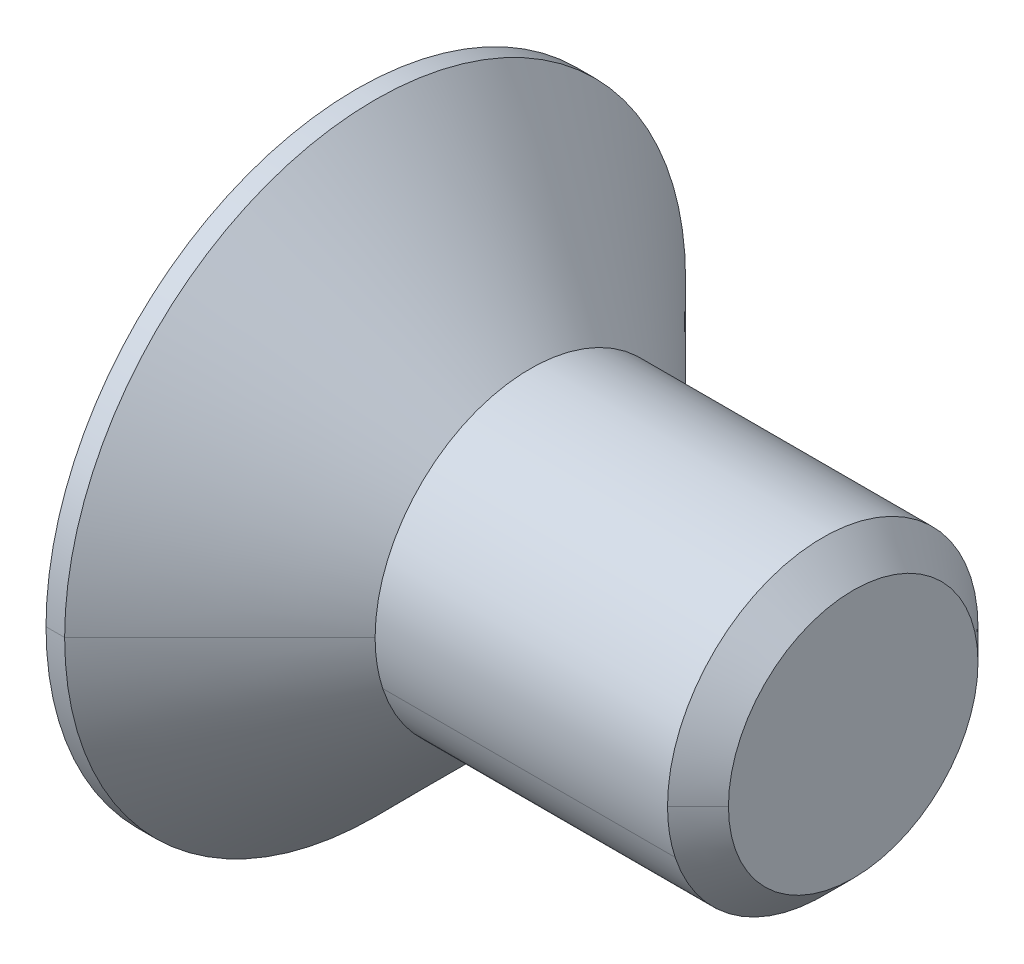
ISO-10303-21;
HEADER;
FILE_DESCRIPTION(('STEP AP214'),'2;1');
FILE_NAME('part.step','',(''),(''),'','','');
FILE_SCHEMA(('AUTOMOTIVE_DESIGN { 1 0 10303 214 1 1 1 1 }'));
ENDSEC;
DATA;
#1=APPLICATION_CONTEXT('core data for automotive mechanical design processes');
#2=APPLICATION_PROTOCOL_DEFINITION('international standard','automotive_design',2000,#1);
#3=PRODUCT_CONTEXT('',#1,'mechanical');
#4=PRODUCT('Part','Part','',(#3));
#5=PRODUCT_RELATED_PRODUCT_CATEGORY('part','',(#4));
#6=PRODUCT_DEFINITION_FORMATION('','',#4);
#7=PRODUCT_DEFINITION_CONTEXT('part definition',#1,'design');
#8=PRODUCT_DEFINITION('design','',#6,#7);
#9=PRODUCT_DEFINITION_SHAPE('','',#8);
#10=(LENGTH_UNIT() NAMED_UNIT(*) SI_UNIT(.MILLI.,.METRE.));
#11=(NAMED_UNIT(*) PLANE_ANGLE_UNIT() SI_UNIT($,.RADIAN.));
#12=(NAMED_UNIT(*) SI_UNIT($,.STERADIAN.) SOLID_ANGLE_UNIT());
#13=UNCERTAINTY_MEASURE_WITH_UNIT(LENGTH_MEASURE(1.E-05),#10,'distance_accuracy_value','');
#14=(GEOMETRIC_REPRESENTATION_CONTEXT(3) GLOBAL_UNCERTAINTY_ASSIGNED_CONTEXT((#13)) GLOBAL_UNIT_ASSIGNED_CONTEXT((#10,
#11,#12)) REPRESENTATION_CONTEXT('',''));
#15=CARTESIAN_POINT('',(0.,0.,0.));
#16=DIRECTION('',(0.,0.,1.));
#17=DIRECTION('',(1.,0.,0.));
#18=AXIS2_PLACEMENT_3D('',#15,#16,#17);
#19=CARTESIAN_POINT('',(-2.8,0.,0.));
#20=DIRECTION('',(1.,0.,0.));
#21=DIRECTION('',(0.,0.,-1.));
#22=AXIS2_PLACEMENT_3D('',#19,#20,#21);
#23=PLANE('',#22);
#24=CARTESIAN_POINT('',(-2.8,0.,0.));
#25=DIRECTION('',(1.,0.,0.));
#26=DIRECTION('',(0.,0.,-1.));
#27=AXIS2_PLACEMENT_3D('',#24,#25,#26);
#28=CIRCLE('',#27,5.);
#29=CARTESIAN_POINT('',(-2.8,0.,5.));
#30=VERTEX_POINT('',#29);
#31=CARTESIAN_POINT('',(-2.8,0.,-5.));
#32=VERTEX_POINT('',#31);
#33=EDGE_CURVE('E11',#30,#32,#28,.T.);
#34=ORIENTED_EDGE('',*,*,#33,.F.);
#35=CARTESIAN_POINT('',(-2.8,0.,0.));
#36=DIRECTION('',(1.,0.,0.));
#37=DIRECTION('',(0.,0.,-1.));
#38=AXIS2_PLACEMENT_3D('',#35,#36,#37);
#39=CIRCLE('',#38,5.);
#40=EDGE_CURVE('E25',#32,#30,#39,.T.);
#41=ORIENTED_EDGE('',*,*,#40,.F.);
#42=EDGE_LOOP('',(#34,#41));
#43=FACE_BOUND('',#42,.T.);
#44=DIRECTION('',(0.,0.500000000000009,-0.866025403784433));
#45=VECTOR('',#44,1.);
#46=CARTESIAN_POINT('',(-2.8,-1.7320508075689,0.));
#47=LINE('',#46,#45);
#48=CARTESIAN_POINT('',(-2.8,-1.7320508075689,0.));
#49=VERTEX_POINT('',#48);
#50=CARTESIAN_POINT('',(-2.8,-0.86602540378444,-1.5));
#51=VERTEX_POINT('',#50);
#52=EDGE_CURVE('E354',#49,#51,#47,.T.);
#53=ORIENTED_EDGE('',*,*,#52,.T.);
#54=DIRECTION('',(0.,1.,0.));
#55=VECTOR('',#54,1.);
#56=CARTESIAN_POINT('',(-2.8,-0.86602540378444,-1.5));
#57=LINE('',#56,#55);
#58=CARTESIAN_POINT('',(-2.8,0.86602540378444,-1.5));
#59=VERTEX_POINT('',#58);
#60=EDGE_CURVE('E350',#51,#59,#57,.T.);
#61=ORIENTED_EDGE('',*,*,#60,.T.);
#62=DIRECTION('',(0.,0.500000000000009,0.866025403784433));
#63=VECTOR('',#62,1.);
#64=CARTESIAN_POINT('',(-2.8,0.86602540378444,-1.5));
#65=LINE('',#64,#63);
#66=CARTESIAN_POINT('',(-2.8,1.7320508075689,0.));
#67=VERTEX_POINT('',#66);
#68=EDGE_CURVE('E346',#59,#67,#65,.T.);
#69=ORIENTED_EDGE('',*,*,#68,.T.);
#70=DIRECTION('',(0.,-0.500000000000009,0.866025403784433));
#71=VECTOR('',#70,1.);
#72=CARTESIAN_POINT('',(-2.8,1.7320508075689,0.));
#73=LINE('',#72,#71);
#74=CARTESIAN_POINT('',(-2.8,0.86602540378444,1.5));
#75=VERTEX_POINT('',#74);
#76=EDGE_CURVE('E342',#67,#75,#73,.T.);
#77=ORIENTED_EDGE('',*,*,#76,.T.);
#78=DIRECTION('',(0.,-1.,0.));
#79=VECTOR('',#78,1.);
#80=CARTESIAN_POINT('',(-2.8,0.86602540378444,1.5));
#81=LINE('',#80,#79);
#82=CARTESIAN_POINT('',(-2.8,-0.86602540378444,1.5));
#83=VERTEX_POINT('',#82);
#84=EDGE_CURVE('E338',#75,#83,#81,.T.);
#85=ORIENTED_EDGE('',*,*,#84,.T.);
#86=DIRECTION('',(0.,-0.500000000000009,-0.866025403784433));
#87=VECTOR('',#86,1.);
#88=CARTESIAN_POINT('',(-2.8,-0.86602540378444,1.5));
#89=LINE('',#88,#87);
#90=EDGE_CURVE('E334',#83,#49,#89,.T.);
#91=ORIENTED_EDGE('',*,*,#90,.T.);
#92=EDGE_LOOP('',(#53,#61,#69,#77,#85,#91));
#93=FACE_BOUND('',#92,.T.);
#94=ADVANCED_FACE('F17',(#43,#93),#23,.F.);
#95=CARTESIAN_POINT('',(-1.4,-0.86602540378444,1.5));
#96=DIRECTION('',(0.,0.866025403784433,-0.500000000000009));
#97=DIRECTION('',(0.,0.500000000000009,0.866025403784433));
#98=AXIS2_PLACEMENT_3D('',#95,#96,#97);
#99=PLANE('',#98);
#100=ORIENTED_EDGE('',*,*,#90,.F.);
#101=DIRECTION('',(-1.,0.,0.));
#102=VECTOR('',#101,1.);
#103=CARTESIAN_POINT('',(-1.4,-0.86602540378444,1.5));
#104=LINE('',#103,#102);
#105=CARTESIAN_POINT('',(-1.4,-0.86602540378444,1.5));
#106=VERTEX_POINT('',#105);
#107=EDGE_CURVE('E329',#106,#83,#104,.T.);
#108=ORIENTED_EDGE('',*,*,#107,.F.);
#109=DIRECTION('',(0.,-0.500000000000009,-0.866025403784433));
#110=VECTOR('',#109,1.);
#111=CARTESIAN_POINT('',(-1.4,-0.86602540378444,1.5));
#112=LINE('',#111,#110);
#113=CARTESIAN_POINT('',(-1.4,-1.29903810567666,0.750000000000019));
#114=VERTEX_POINT('',#113);
#115=EDGE_CURVE('E325',#106,#114,#112,.T.);
#116=ORIENTED_EDGE('',*,*,#115,.T.);
#117=DIRECTION('',(0.,-0.500000000000009,-0.866025403784433));
#118=VECTOR('',#117,1.);
#119=CARTESIAN_POINT('',(-1.4,-0.86602540378444,1.5));
#120=LINE('',#119,#118);
#121=CARTESIAN_POINT('',(-1.4,-1.7320508075689,0.));
#122=VERTEX_POINT('',#121);
#123=EDGE_CURVE('E321',#114,#122,#120,.T.);
#124=ORIENTED_EDGE('',*,*,#123,.T.);
#125=DIRECTION('',(-1.,0.,0.));
#126=VECTOR('',#125,1.);
#127=CARTESIAN_POINT('',(-1.4,-1.7320508075689,0.));
#128=LINE('',#127,#126);
#129=EDGE_CURVE('E316',#122,#49,#128,.T.);
#130=ORIENTED_EDGE('',*,*,#129,.T.);
#131=EDGE_LOOP('',(#100,#108,#116,#124,#130));
#132=FACE_BOUND('',#131,.T.);
#133=ADVANCED_FACE('F390',(#132),#99,.T.);
#134=CARTESIAN_POINT('',(-1.4,-1.7320508075689,0.));
#135=DIRECTION('',(0.,0.866025403784433,0.500000000000009));
#136=DIRECTION('',(0.,-0.500000000000009,0.866025403784433));
#137=AXIS2_PLACEMENT_3D('',#134,#135,#136);
#138=PLANE('',#137);
#139=ORIENTED_EDGE('',*,*,#52,.F.);
#140=ORIENTED_EDGE('',*,*,#129,.F.);
#141=DIRECTION('',(0.,0.500000000000009,-0.866025403784433));
#142=VECTOR('',#141,1.);
#143=CARTESIAN_POINT('',(-1.4,-1.7320508075689,0.));
#144=LINE('',#143,#142);
#145=CARTESIAN_POINT('',(-1.4,-1.29903810567665,-0.750000000000014));
#146=VERTEX_POINT('',#145);
#147=EDGE_CURVE('E312',#122,#146,#144,.T.);
#148=ORIENTED_EDGE('',*,*,#147,.T.);
#149=DIRECTION('',(0.,0.500000000000009,-0.866025403784433));
#150=VECTOR('',#149,1.);
#151=CARTESIAN_POINT('',(-1.4,-1.7320508075689,0.));
#152=LINE('',#151,#150);
#153=CARTESIAN_POINT('',(-1.4,-0.86602540378444,-1.5));
#154=VERTEX_POINT('',#153);
#155=EDGE_CURVE('E308',#146,#154,#152,.T.);
#156=ORIENTED_EDGE('',*,*,#155,.T.);
#157=DIRECTION('',(-1.,0.,0.));
#158=VECTOR('',#157,1.);
#159=CARTESIAN_POINT('',(-1.4,-0.86602540378444,-1.5));
#160=LINE('',#159,#158);
#161=EDGE_CURVE('E303',#154,#51,#160,.T.);
#162=ORIENTED_EDGE('',*,*,#161,.T.);
#163=EDGE_LOOP('',(#139,#140,#148,#156,#162));
#164=FACE_BOUND('',#163,.T.);
#165=ADVANCED_FACE('F394',(#164),#138,.T.);
#166=CARTESIAN_POINT('',(-1.4,-0.86602540378444,-1.5));
#167=DIRECTION('',(0.,0.,1.));
#168=DIRECTION('',(1.,0.,0.));
#169=AXIS2_PLACEMENT_3D('',#166,#167,#168);
#170=PLANE('',#169);
#171=ORIENTED_EDGE('',*,*,#60,.F.);
#172=ORIENTED_EDGE('',*,*,#161,.F.);
#173=DIRECTION('',(0.,1.,0.));
#174=VECTOR('',#173,1.);
#175=CARTESIAN_POINT('',(-1.4,-0.86602540378444,-1.5));
#176=LINE('',#175,#174);
#177=CARTESIAN_POINT('',(-1.4,0.,-1.5));
#178=VERTEX_POINT('',#177);
#179=EDGE_CURVE('E299',#154,#178,#176,.T.);
#180=ORIENTED_EDGE('',*,*,#179,.T.);
#181=DIRECTION('',(0.,1.,0.));
#182=VECTOR('',#181,1.);
#183=CARTESIAN_POINT('',(-1.4,-0.86602540378444,-1.5));
#184=LINE('',#183,#182);
#185=CARTESIAN_POINT('',(-1.4,0.86602540378444,-1.5));
#186=VERTEX_POINT('',#185);
#187=EDGE_CURVE('E295',#178,#186,#184,.T.);
#188=ORIENTED_EDGE('',*,*,#187,.T.);
#189=DIRECTION('',(-1.,0.,0.));
#190=VECTOR('',#189,1.);
#191=CARTESIAN_POINT('',(-1.4,0.86602540378444,-1.5));
#192=LINE('',#191,#190);
#193=EDGE_CURVE('E290',#186,#59,#192,.T.);
#194=ORIENTED_EDGE('',*,*,#193,.T.);
#195=EDGE_LOOP('',(#171,#172,#180,#188,#194));
#196=FACE_BOUND('',#195,.T.);
#197=ADVANCED_FACE('F406',(#196),#170,.T.);
#198=CARTESIAN_POINT('',(-1.4,0.86602540378444,-1.5));
#199=DIRECTION('',(0.,-0.866025403784433,0.500000000000009));
#200=DIRECTION('',(0.,-0.500000000000009,-0.866025403784433));
#201=AXIS2_PLACEMENT_3D('',#198,#199,#200);
#202=PLANE('',#201);
#203=ORIENTED_EDGE('',*,*,#68,.F.);
#204=ORIENTED_EDGE('',*,*,#193,.F.);
#205=DIRECTION('',(0.,0.500000000000009,0.866025403784433));
#206=VECTOR('',#205,1.);
#207=CARTESIAN_POINT('',(-1.4,0.86602540378444,-1.5));
#208=LINE('',#207,#206);
#209=CARTESIAN_POINT('',(-1.4,1.29903810567666,-0.750000000000019));
#210=VERTEX_POINT('',#209);
#211=EDGE_CURVE('E286',#186,#210,#208,.T.);
#212=ORIENTED_EDGE('',*,*,#211,.T.);
#213=DIRECTION('',(0.,0.500000000000009,0.866025403784433));
#214=VECTOR('',#213,1.);
#215=CARTESIAN_POINT('',(-1.4,0.86602540378444,-1.5));
#216=LINE('',#215,#214);
#217=CARTESIAN_POINT('',(-1.4,1.7320508075689,0.));
#218=VERTEX_POINT('',#217);
#219=EDGE_CURVE('E282',#210,#218,#216,.T.);
#220=ORIENTED_EDGE('',*,*,#219,.T.);
#221=DIRECTION('',(-1.,0.,0.));
#222=VECTOR('',#221,1.);
#223=CARTESIAN_POINT('',(-1.4,1.7320508075689,0.));
#224=LINE('',#223,#222);
#225=EDGE_CURVE('E277',#218,#67,#224,.T.);
#226=ORIENTED_EDGE('',*,*,#225,.T.);
#227=EDGE_LOOP('',(#203,#204,#212,#220,#226));
#228=FACE_BOUND('',#227,.T.);
#229=ADVANCED_FACE('F412',(#228),#202,.T.);
#230=CARTESIAN_POINT('',(-1.4,1.7320508075689,0.));
#231=DIRECTION('',(0.,-0.866025403784433,-0.500000000000009));
#232=DIRECTION('',(0.,0.500000000000009,-0.866025403784433));
#233=AXIS2_PLACEMENT_3D('',#230,#231,#232);
#234=PLANE('',#233);
#235=ORIENTED_EDGE('',*,*,#76,.F.);
#236=ORIENTED_EDGE('',*,*,#225,.F.);
#237=DIRECTION('',(0.,-0.500000000000009,0.866025403784433));
#238=VECTOR('',#237,1.);
#239=CARTESIAN_POINT('',(-1.4,1.7320508075689,0.));
#240=LINE('',#239,#238);
#241=CARTESIAN_POINT('',(-1.4,1.29903810567666,0.750000000000019));
#242=VERTEX_POINT('',#241);
#243=EDGE_CURVE('E273',#218,#242,#240,.T.);
#244=ORIENTED_EDGE('',*,*,#243,.T.);
#245=DIRECTION('',(0.,-0.500000000000009,0.866025403784433));
#246=VECTOR('',#245,1.);
#247=CARTESIAN_POINT('',(-1.4,1.7320508075689,0.));
#248=LINE('',#247,#246);
#249=CARTESIAN_POINT('',(-1.4,0.86602540378444,1.5));
#250=VERTEX_POINT('',#249);
#251=EDGE_CURVE('E269',#242,#250,#248,.T.);
#252=ORIENTED_EDGE('',*,*,#251,.T.);
#253=DIRECTION('',(-1.,0.,0.));
#254=VECTOR('',#253,1.);
#255=CARTESIAN_POINT('',(-1.4,0.86602540378444,1.5));
#256=LINE('',#255,#254);
#257=EDGE_CURVE('E264',#250,#75,#256,.T.);
#258=ORIENTED_EDGE('',*,*,#257,.T.);
#259=EDGE_LOOP('',(#235,#236,#244,#252,#258));
#260=FACE_BOUND('',#259,.T.);
#261=ADVANCED_FACE('F418',(#260),#234,.T.);
#262=CARTESIAN_POINT('',(-1.4,0.86602540378444,1.5));
#263=DIRECTION('',(0.,0.,-1.));
#264=DIRECTION('',(-1.,0.,0.));
#265=AXIS2_PLACEMENT_3D('',#262,#263,#264);
#266=PLANE('',#265);
#267=ORIENTED_EDGE('',*,*,#84,.F.);
#268=ORIENTED_EDGE('',*,*,#257,.F.);
#269=DIRECTION('',(0.,-1.,0.));
#270=VECTOR('',#269,1.);
#271=CARTESIAN_POINT('',(-1.4,0.86602540378444,1.5));
#272=LINE('',#271,#270);
#273=CARTESIAN_POINT('',(-1.4,0.,1.5));
#274=VERTEX_POINT('',#273);
#275=EDGE_CURVE('E260',#250,#274,#272,.T.);
#276=ORIENTED_EDGE('',*,*,#275,.T.);
#277=DIRECTION('',(0.,-1.,0.));
#278=VECTOR('',#277,1.);
#279=CARTESIAN_POINT('',(-1.4,0.86602540378444,1.5));
#280=LINE('',#279,#278);
#281=EDGE_CURVE('E255',#274,#106,#280,.T.);
#282=ORIENTED_EDGE('',*,*,#281,.T.);
#283=ORIENTED_EDGE('',*,*,#107,.T.);
#284=EDGE_LOOP('',(#267,#268,#276,#282,#283));
#285=FACE_BOUND('',#284,.T.);
#286=ADVANCED_FACE('F422',(#285),#266,.T.);
#287=CARTESIAN_POINT('',(-1.4,0.,0.));
#288=DIRECTION('',(1.,0.,0.));
#289=DIRECTION('',(0.,0.,-1.));
#290=AXIS2_PLACEMENT_3D('',#287,#288,#289);
#291=PLANE('',#290);
#292=CARTESIAN_POINT('',(-1.4,0.,0.));
#293=DIRECTION('',(1.,0.,0.));
#294=DIRECTION('',(0.,0.,-1.));
#295=AXIS2_PLACEMENT_3D('',#292,#293,#294);
#296=CIRCLE('',#295,1.5);
#297=EDGE_CURVE('E250',#274,#114,#296,.T.);
#298=ORIENTED_EDGE('',*,*,#297,.T.);
#299=ORIENTED_EDGE('',*,*,#115,.F.);
#300=ORIENTED_EDGE('',*,*,#281,.F.);
#301=EDGE_LOOP('',(#298,#299,#300));
#302=FACE_BOUND('',#301,.T.);
#303=ADVANCED_FACE('F463',(#302),#291,.F.);
#304=CARTESIAN_POINT('',(-1.4,0.,0.));
#305=DIRECTION('',(-1.,0.,0.));
#306=DIRECTION('',(0.,1.,0.));
#307=AXIS2_PLACEMENT_3D('',#304,#305,#306);
#308=CONICAL_SURFACE('',#307,1.5,1.30899693899575);
#309=DIRECTION('',(-0.258819045102518,0.,-0.965925826289069));
#310=VECTOR('',#309,1.);
#311=CARTESIAN_POINT('',(-0.998076211353321,0.,0.));
#312=LINE('',#311,#310);
#313=CARTESIAN_POINT('',(-0.998076211353321,0.,0.));
#314=VERTEX_POINT('',#313);
#315=EDGE_CURVE('E245',#314,#178,#312,.T.);
#316=ORIENTED_EDGE('',*,*,#315,.T.);
#317=CARTESIAN_POINT('',(-1.4,0.,0.));
#318=DIRECTION('',(1.,0.,0.));
#319=DIRECTION('',(0.,0.,-1.));
#320=AXIS2_PLACEMENT_3D('',#317,#318,#319);
#321=CIRCLE('',#320,1.5);
#322=EDGE_CURVE('E240',#146,#178,#321,.T.);
#323=ORIENTED_EDGE('',*,*,#322,.F.);
#324=CARTESIAN_POINT('',(-1.4,0.,0.));
#325=DIRECTION('',(1.,0.,0.));
#326=DIRECTION('',(0.,0.,-1.));
#327=AXIS2_PLACEMENT_3D('',#324,#325,#326);
#328=CIRCLE('',#327,1.5);
#329=EDGE_CURVE('E235',#114,#146,#328,.T.);
#330=ORIENTED_EDGE('',*,*,#329,.F.);
#331=ORIENTED_EDGE('',*,*,#297,.F.);
#332=DIRECTION('',(-0.258819045102518,0.,0.965925826289069));
#333=VECTOR('',#332,1.);
#334=CARTESIAN_POINT('',(-0.998076211353321,0.,0.));
#335=LINE('',#334,#333);
#336=EDGE_CURVE('E230',#314,#274,#335,.T.);
#337=ORIENTED_EDGE('',*,*,#336,.F.);
#338=EDGE_LOOP('',(#316,#323,#330,#331,#337));
#339=FACE_BOUND('',#338,.T.);
#340=ADVANCED_FACE('F431',(#339),#308,.F.);
#341=CARTESIAN_POINT('',(-1.4,0.,0.));
#342=DIRECTION('',(-1.,0.,0.));
#343=DIRECTION('',(0.,-1.,0.));
#344=AXIS2_PLACEMENT_3D('',#341,#342,#343);
#345=CONICAL_SURFACE('',#344,1.5,1.30899693899575);
#346=ORIENTED_EDGE('',*,*,#336,.T.);
#347=CARTESIAN_POINT('',(-1.4,0.,0.));
#348=DIRECTION('',(1.,0.,0.));
#349=DIRECTION('',(0.,0.,-1.));
#350=AXIS2_PLACEMENT_3D('',#347,#348,#349);
#351=CIRCLE('',#350,1.5);
#352=EDGE_CURVE('E225',#242,#274,#351,.T.);
#353=ORIENTED_EDGE('',*,*,#352,.F.);
#354=CARTESIAN_POINT('',(-1.4,0.,0.));
#355=DIRECTION('',(1.,0.,0.));
#356=DIRECTION('',(0.,0.,-1.));
#357=AXIS2_PLACEMENT_3D('',#354,#355,#356);
#358=CIRCLE('',#357,1.5);
#359=EDGE_CURVE('E220',#210,#242,#358,.T.);
#360=ORIENTED_EDGE('',*,*,#359,.F.);
#361=CARTESIAN_POINT('',(-1.4,0.,0.));
#362=DIRECTION('',(1.,0.,0.));
#363=DIRECTION('',(0.,0.,-1.));
#364=AXIS2_PLACEMENT_3D('',#361,#362,#363);
#365=CIRCLE('',#364,1.5);
#366=EDGE_CURVE('E215',#178,#210,#365,.T.);
#367=ORIENTED_EDGE('',*,*,#366,.F.);
#368=ORIENTED_EDGE('',*,*,#315,.F.);
#369=EDGE_LOOP('',(#346,#353,#360,#367,#368));
#370=FACE_BOUND('',#369,.T.);
#371=ADVANCED_FACE('F456',(#370),#345,.F.);
#372=CARTESIAN_POINT('',(-1.4,0.,0.));
#373=DIRECTION('',(1.,0.,0.));
#374=DIRECTION('',(0.,0.,-1.));
#375=AXIS2_PLACEMENT_3D('',#372,#373,#374);
#376=PLANE('',#375);
#377=ORIENTED_EDGE('',*,*,#366,.T.);
#378=ORIENTED_EDGE('',*,*,#211,.F.);
#379=ORIENTED_EDGE('',*,*,#187,.F.);
#380=EDGE_LOOP('',(#377,#378,#379));
#381=FACE_BOUND('',#380,.T.);
#382=ADVANCED_FACE('F452',(#381),#376,.F.);
#383=CARTESIAN_POINT('',(-1.4,0.,0.));
#384=DIRECTION('',(1.,0.,0.));
#385=DIRECTION('',(0.,0.,-1.));
#386=AXIS2_PLACEMENT_3D('',#383,#384,#385);
#387=PLANE('',#386);
#388=ORIENTED_EDGE('',*,*,#219,.F.);
#389=ORIENTED_EDGE('',*,*,#359,.T.);
#390=ORIENTED_EDGE('',*,*,#243,.F.);
#391=EDGE_LOOP('',(#388,#389,#390));
#392=FACE_BOUND('',#391,.T.);
#393=ADVANCED_FACE('F445',(#392),#387,.F.);
#394=CARTESIAN_POINT('',(-1.4,0.,0.));
#395=DIRECTION('',(1.,0.,0.));
#396=DIRECTION('',(0.,0.,-1.));
#397=AXIS2_PLACEMENT_3D('',#394,#395,#396);
#398=PLANE('',#397);
#399=ORIENTED_EDGE('',*,*,#352,.T.);
#400=ORIENTED_EDGE('',*,*,#275,.F.);
#401=ORIENTED_EDGE('',*,*,#251,.F.);
#402=EDGE_LOOP('',(#399,#400,#401));
#403=FACE_BOUND('',#402,.T.);
#404=ADVANCED_FACE('F438',(#403),#398,.F.);
#405=CARTESIAN_POINT('',(-1.4,0.,0.));
#406=DIRECTION('',(1.,0.,0.));
#407=DIRECTION('',(0.,0.,-1.));
#408=AXIS2_PLACEMENT_3D('',#405,#406,#407);
#409=PLANE('',#408);
#410=ORIENTED_EDGE('',*,*,#329,.T.);
#411=ORIENTED_EDGE('',*,*,#147,.F.);
#412=ORIENTED_EDGE('',*,*,#123,.F.);
#413=EDGE_LOOP('',(#410,#411,#412));
#414=FACE_BOUND('',#413,.T.);
#415=ADVANCED_FACE('F436',(#414),#409,.F.);
#416=CARTESIAN_POINT('',(-1.4,0.,0.));
#417=DIRECTION('',(1.,0.,0.));
#418=DIRECTION('',(0.,0.,-1.));
#419=AXIS2_PLACEMENT_3D('',#416,#417,#418);
#420=PLANE('',#419);
#421=ORIENTED_EDGE('',*,*,#322,.T.);
#422=ORIENTED_EDGE('',*,*,#179,.F.);
#423=ORIENTED_EDGE('',*,*,#155,.F.);
#424=EDGE_LOOP('',(#421,#422,#423));
#425=FACE_BOUND('',#424,.T.);
#426=ADVANCED_FACE('F435',(#425),#420,.F.);
#427=CARTESIAN_POINT('',(5.2,0.,0.));
#428=DIRECTION('',(1.,0.,0.));
#429=DIRECTION('',(0.,-1.,0.));
#430=AXIS2_PLACEMENT_3D('',#427,#428,#429);
#431=CYLINDRICAL_SURFACE('',#430,5.);
#432=DIRECTION('',(1.,0.,0.));
#433=VECTOR('',#432,1.);
#434=CARTESIAN_POINT('',(-2.8,0.,5.));
#435=LINE('',#434,#433);
#436=CARTESIAN_POINT('',(-2.5,0.,5.));
#437=VERTEX_POINT('',#436);
#438=EDGE_CURVE('E211',#30,#437,#435,.T.);
#439=ORIENTED_EDGE('',*,*,#438,.T.);
#440=CARTESIAN_POINT('',(-2.5,0.,0.));
#441=DIRECTION('',(1.,0.,0.));
#442=DIRECTION('',(0.,0.,-1.));
#443=AXIS2_PLACEMENT_3D('',#440,#441,#442);
#444=CIRCLE('',#443,5.);
#445=CARTESIAN_POINT('',(-2.5,0.,-5.));
#446=VERTEX_POINT('',#445);
#447=EDGE_CURVE('E206',#446,#437,#444,.T.);
#448=ORIENTED_EDGE('',*,*,#447,.F.);
#449=DIRECTION('',(1.,0.,0.));
#450=VECTOR('',#449,1.);
#451=CARTESIAN_POINT('',(-2.8,0.,-5.));
#452=LINE('',#451,#450);
#453=EDGE_CURVE('E201',#32,#446,#452,.T.);
#454=ORIENTED_EDGE('',*,*,#453,.F.);
#455=ORIENTED_EDGE('',*,*,#40,.T.);
#456=EDGE_LOOP('',(#439,#448,#454,#455));
#457=FACE_BOUND('',#456,.T.);
#458=ADVANCED_FACE('F363',(#457),#431,.T.);
#459=CARTESIAN_POINT('',(5.2,0.,0.));
#460=DIRECTION('',(1.,0.,0.));
#461=DIRECTION('',(0.,1.,0.));
#462=AXIS2_PLACEMENT_3D('',#459,#460,#461);
#463=CYLINDRICAL_SURFACE('',#462,5.);
#464=ORIENTED_EDGE('',*,*,#438,.F.);
#465=ORIENTED_EDGE('',*,*,#33,.T.);
#466=ORIENTED_EDGE('',*,*,#453,.T.);
#467=CARTESIAN_POINT('',(-2.5,0.,0.));
#468=DIRECTION('',(1.,0.,0.));
#469=DIRECTION('',(0.,0.,-1.));
#470=AXIS2_PLACEMENT_3D('',#467,#468,#469);
#471=CIRCLE('',#470,5.);
#472=EDGE_CURVE('E196',#437,#446,#471,.T.);
#473=ORIENTED_EDGE('',*,*,#472,.F.);
#474=EDGE_LOOP('',(#464,#465,#466,#473));
#475=FACE_BOUND('',#474,.T.);
#476=ADVANCED_FACE('F366',(#475),#463,.T.);
#477=CARTESIAN_POINT('',(-2.5,0.,0.));
#478=DIRECTION('',(-1.,0.,0.));
#479=DIRECTION('',(0.,1.,0.));
#480=AXIS2_PLACEMENT_3D('',#477,#478,#479);
#481=CONICAL_SURFACE('',#480,5.,0.785398163397448);
#482=DIRECTION('',(-0.707106781186548,0.,-0.707106781186547));
#483=VECTOR('',#482,1.);
#484=CARTESIAN_POINT('',(0.,0.,-2.5));
#485=LINE('',#484,#483);
#486=CARTESIAN_POINT('',(0.,0.,-2.5));
#487=VERTEX_POINT('',#486);
#488=EDGE_CURVE('E191',#487,#446,#485,.T.);
#489=ORIENTED_EDGE('',*,*,#488,.F.);
#490=CARTESIAN_POINT('',(0.,0.,0.));
#491=DIRECTION('',(1.,0.,0.));
#492=DIRECTION('',(0.,0.,-1.));
#493=AXIS2_PLACEMENT_3D('',#490,#491,#492);
#494=CIRCLE('',#493,2.5);
#495=CARTESIAN_POINT('',(0.,-0.772542485937367,2.37764129073788));
#496=VERTEX_POINT('',#495);
#497=EDGE_CURVE('E186',#496,#487,#494,.T.);
#498=ORIENTED_EDGE('',*,*,#497,.F.);
#499=CARTESIAN_POINT('',(0.,0.,0.));
#500=DIRECTION('',(1.,0.,0.));
#501=DIRECTION('',(0.,0.,-1.));
#502=AXIS2_PLACEMENT_3D('',#499,#500,#501);
#503=CIRCLE('',#502,2.5);
#504=CARTESIAN_POINT('',(0.,0.,2.5));
#505=VERTEX_POINT('',#504);
#506=EDGE_CURVE('E181',#505,#496,#503,.T.);
#507=ORIENTED_EDGE('',*,*,#506,.F.);
#508=DIRECTION('',(-0.707106781186548,0.,0.707106781186547));
#509=VECTOR('',#508,1.);
#510=CARTESIAN_POINT('',(0.,0.,2.5));
#511=LINE('',#510,#509);
#512=EDGE_CURVE('E176',#505,#437,#511,.T.);
#513=ORIENTED_EDGE('',*,*,#512,.T.);
#514=ORIENTED_EDGE('',*,*,#472,.T.);
#515=EDGE_LOOP('',(#489,#498,#507,#513,#514));
#516=FACE_BOUND('',#515,.T.);
#517=ADVANCED_FACE('F369',(#516),#481,.T.);
#518=CARTESIAN_POINT('',(-2.5,0.,0.));
#519=DIRECTION('',(-1.,0.,0.));
#520=DIRECTION('',(0.,-1.,0.));
#521=AXIS2_PLACEMENT_3D('',#518,#519,#520);
#522=CONICAL_SURFACE('',#521,5.,0.785398163397448);
#523=ORIENTED_EDGE('',*,*,#488,.T.);
#524=ORIENTED_EDGE('',*,*,#447,.T.);
#525=ORIENTED_EDGE('',*,*,#512,.F.);
#526=CARTESIAN_POINT('',(0.,0.,0.));
#527=DIRECTION('',(1.,0.,0.));
#528=DIRECTION('',(0.,0.,-1.));
#529=AXIS2_PLACEMENT_3D('',#526,#527,#528);
#530=CIRCLE('',#529,2.5);
#531=EDGE_CURVE('E171',#487,#505,#530,.T.);
#532=ORIENTED_EDGE('',*,*,#531,.F.);
#533=EDGE_LOOP('',(#523,#524,#525,#532));
#534=FACE_BOUND('',#533,.T.);
#535=ADVANCED_FACE('F372',(#534),#522,.T.);
#536=CARTESIAN_POINT('',(5.2,0.,0.));
#537=DIRECTION('',(1.,0.,0.));
#538=DIRECTION('',(0.,-0.987688340595138,-0.156434465040231));
#539=AXIS2_PLACEMENT_3D('',#536,#537,#538);
#540=CYLINDRICAL_SURFACE('',#539,2.5);
#541=DIRECTION('',(1.,0.,0.));
#542=VECTOR('',#541,1.);
#543=CARTESIAN_POINT('',(0.,-0.772542485937367,2.37764129073788));
#544=LINE('',#543,#542);
#545=CARTESIAN_POINT('',(4.7095,-0.772542485937367,2.37764129073788));
#546=VERTEX_POINT('',#545);
#547=EDGE_CURVE('E167',#496,#546,#544,.T.);
#548=ORIENTED_EDGE('',*,*,#547,.T.);
#549=CARTESIAN_POINT('',(4.7095,0.,0.));
#550=DIRECTION('',(1.,0.,0.));
#551=DIRECTION('',(0.,0.,-1.));
#552=AXIS2_PLACEMENT_3D('',#549,#550,#551);
#553=CIRCLE('',#552,2.5);
#554=CARTESIAN_POINT('',(4.7095,0.,2.5));
#555=VERTEX_POINT('',#554);
#556=EDGE_CURVE('E163',#555,#546,#553,.T.);
#557=ORIENTED_EDGE('',*,*,#556,.F.);
#558=CARTESIAN_POINT('',(4.7095,0.,0.));
#559=DIRECTION('',(1.,0.,0.));
#560=DIRECTION('',(0.,0.,-1.));
#561=AXIS2_PLACEMENT_3D('',#558,#559,#560);
#562=CIRCLE('',#561,2.5);
#563=CARTESIAN_POINT('',(4.7095,0.,-2.5));
#564=VERTEX_POINT('',#563);
#565=EDGE_CURVE('E141',#564,#555,#562,.T.);
#566=ORIENTED_EDGE('',*,*,#565,.F.);
#567=DIRECTION('',(1.,0.,0.));
#568=VECTOR('',#567,1.);
#569=CARTESIAN_POINT('',(0.,0.,-2.5));
#570=LINE('',#569,#568);
#571=EDGE_CURVE('E155',#487,#564,#570,.T.);
#572=ORIENTED_EDGE('',*,*,#571,.F.);
#573=ORIENTED_EDGE('',*,*,#531,.T.);
#574=ORIENTED_EDGE('',*,*,#506,.T.);
#575=EDGE_LOOP('',(#548,#557,#566,#572,#573,#574));
#576=FACE_BOUND('',#575,.T.);
#577=ADVANCED_FACE('F377',(#576),#540,.T.);
#578=CARTESIAN_POINT('',(5.2,0.,0.));
#579=DIRECTION('',(1.,0.,0.));
#580=DIRECTION('',(0.,0.987688340595138,0.156434465040231));
#581=AXIS2_PLACEMENT_3D('',#578,#579,#580);
#582=CYLINDRICAL_SURFACE('',#581,2.5);
#583=ORIENTED_EDGE('',*,*,#547,.F.);
#584=ORIENTED_EDGE('',*,*,#497,.T.);
#585=ORIENTED_EDGE('',*,*,#571,.T.);
#586=CARTESIAN_POINT('',(4.7095,0.,0.));
#587=DIRECTION('',(1.,0.,0.));
#588=DIRECTION('',(0.,0.,-1.));
#589=AXIS2_PLACEMENT_3D('',#586,#587,#588);
#590=CIRCLE('',#589,2.5);
#591=EDGE_CURVE('E151',#546,#564,#590,.T.);
#592=ORIENTED_EDGE('',*,*,#591,.F.);
#593=EDGE_LOOP('',(#583,#584,#585,#592));
#594=FACE_BOUND('',#593,.T.);
#595=ADVANCED_FACE('F379',(#594),#582,.T.);
#596=CARTESIAN_POINT('',(4.7095,0.,0.));
#597=DIRECTION('',(-1.,0.,0.));
#598=DIRECTION('',(0.,1.,0.));
#599=AXIS2_PLACEMENT_3D('',#596,#597,#598);
#600=CONICAL_SURFACE('',#599,2.5,0.785398163397448);
#601=DIRECTION('',(-0.707106781186548,0.,-0.707106781186547));
#602=VECTOR('',#601,1.);
#603=CARTESIAN_POINT('',(5.2,0.,-2.0095));
#604=LINE('',#603,#602);
#605=CARTESIAN_POINT('',(5.2,0.,-2.0095));
#606=VERTEX_POINT('',#605);
#607=EDGE_CURVE('E132',#606,#564,#604,.T.);
#608=ORIENTED_EDGE('',*,*,#607,.F.);
#609=CARTESIAN_POINT('',(5.2,0.,0.));
#610=DIRECTION('',(1.,0.,0.));
#611=DIRECTION('',(0.,0.,-1.));
#612=AXIS2_PLACEMENT_3D('',#609,#610,#611);
#613=CIRCLE('',#612,2.0095);
#614=CARTESIAN_POINT('',(5.2,0.,2.0095));
#615=VERTEX_POINT('',#614);
#616=EDGE_CURVE('E123',#615,#606,#613,.T.);
#617=ORIENTED_EDGE('',*,*,#616,.F.);
#618=DIRECTION('',(-0.707106781186548,0.,0.707106781186547));
#619=VECTOR('',#618,1.);
#620=CARTESIAN_POINT('',(5.2,0.,2.0095));
#621=LINE('',#620,#619);
#622=EDGE_CURVE('E128',#615,#555,#621,.T.);
#623=ORIENTED_EDGE('',*,*,#622,.T.);
#624=ORIENTED_EDGE('',*,*,#556,.T.);
#625=ORIENTED_EDGE('',*,*,#591,.T.);
#626=EDGE_LOOP('',(#608,#617,#623,#624,#625));
#627=FACE_BOUND('',#626,.T.);
#628=ADVANCED_FACE('F125',(#627),#600,.T.);
#629=CARTESIAN_POINT('',(4.7095,0.,0.));
#630=DIRECTION('',(-1.,0.,0.));
#631=DIRECTION('',(0.,-1.,0.));
#632=AXIS2_PLACEMENT_3D('',#629,#630,#631);
#633=CONICAL_SURFACE('',#632,2.5,0.785398163397448);
#634=ORIENTED_EDGE('',*,*,#607,.T.);
#635=ORIENTED_EDGE('',*,*,#565,.T.);
#636=ORIENTED_EDGE('',*,*,#622,.F.);
#637=CARTESIAN_POINT('',(5.2,0.,0.));
#638=DIRECTION('',(1.,0.,0.));
#639=DIRECTION('',(0.,0.,-1.));
#640=AXIS2_PLACEMENT_3D('',#637,#638,#639);
#641=CIRCLE('',#640,2.0095);
#642=EDGE_CURVE('E136',#606,#615,#641,.T.);
#643=ORIENTED_EDGE('',*,*,#642,.F.);
#644=EDGE_LOOP('',(#634,#635,#636,#643));
#645=FACE_BOUND('',#644,.T.);
#646=ADVANCED_FACE('F140',(#645),#633,.T.);
#647=CARTESIAN_POINT('',(5.2,2.0095,0.));
#648=DIRECTION('',(-1.,0.,0.));
#649=DIRECTION('',(0.,0.,1.));
#650=AXIS2_PLACEMENT_3D('',#647,#648,#649);
#651=PLANE('',#650);
#652=ORIENTED_EDGE('',*,*,#642,.T.);
#653=ORIENTED_EDGE('',*,*,#616,.T.);
#654=EDGE_LOOP('',(#652,#653));
#655=FACE_BOUND('',#654,.T.);
#656=ADVANCED_FACE('F137',(#655),#651,.F.);
#657=CLOSED_SHELL('',(#94,#133,#165,#197,#229,#261,#286,#303,#340,#371,#382,#393,#404,#415,#426,
#458,#476,#517,#535,#577,#595,#628,#646,#656));
#658=MANIFOLD_SOLID_BREP('B1',#657);
#659=ADVANCED_BREP_SHAPE_REPRESENTATION('',(#18,#658),#14);
#660=SHAPE_DEFINITION_REPRESENTATION(#9,#659);
ENDSEC;
END-ISO-10303-21;
